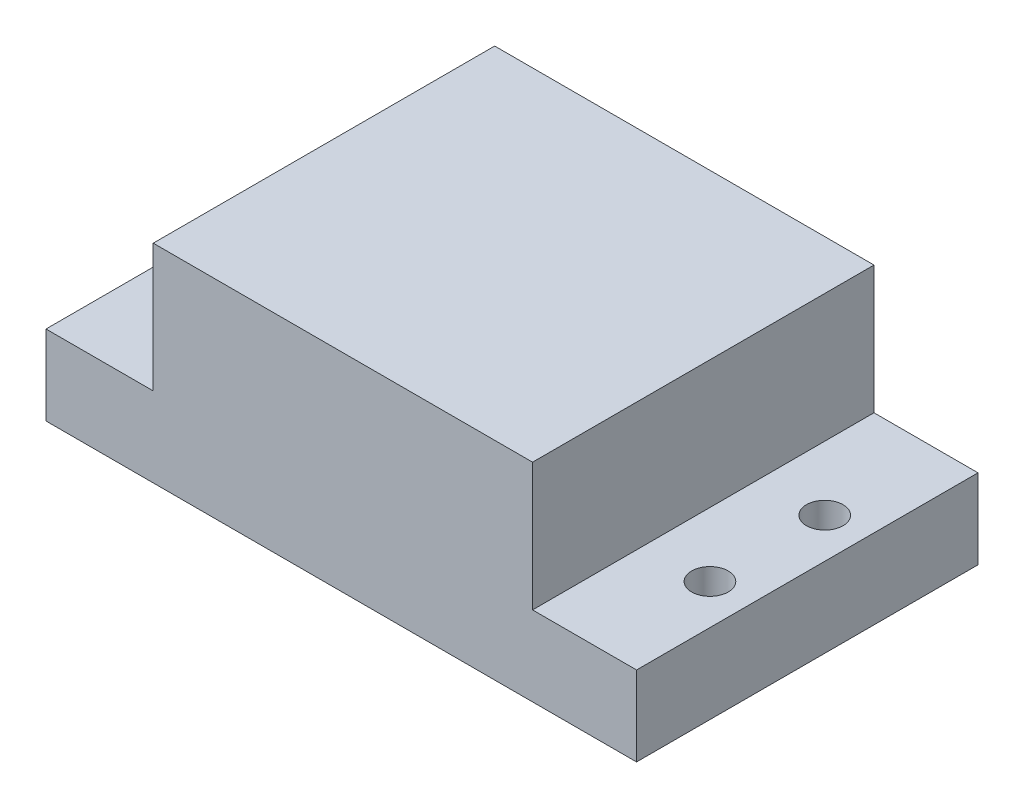
ISO-10303-21;
HEADER;
FILE_DESCRIPTION(('STEP AP214'),'2;1');
FILE_NAME('part.step','',(''),(''),'','','');
FILE_SCHEMA(('AUTOMOTIVE_DESIGN { 1 0 10303 214 1 1 1 1 }'));
ENDSEC;
DATA;
#1=APPLICATION_CONTEXT('core data for automotive mechanical design processes');
#2=APPLICATION_PROTOCOL_DEFINITION('international standard','automotive_design',2000,#1);
#3=PRODUCT_CONTEXT('',#1,'mechanical');
#4=PRODUCT('Part','Part','',(#3));
#5=PRODUCT_RELATED_PRODUCT_CATEGORY('part','',(#4));
#6=PRODUCT_DEFINITION_FORMATION('','',#4);
#7=PRODUCT_DEFINITION_CONTEXT('part definition',#1,'design');
#8=PRODUCT_DEFINITION('design','',#6,#7);
#9=PRODUCT_DEFINITION_SHAPE('','',#8);
#10=(LENGTH_UNIT() NAMED_UNIT(*) SI_UNIT(.MILLI.,.METRE.));
#11=(NAMED_UNIT(*) PLANE_ANGLE_UNIT() SI_UNIT($,.RADIAN.));
#12=(NAMED_UNIT(*) SI_UNIT($,.STERADIAN.) SOLID_ANGLE_UNIT());
#13=UNCERTAINTY_MEASURE_WITH_UNIT(LENGTH_MEASURE(1.E-05),#10,'distance_accuracy_value','');
#14=(GEOMETRIC_REPRESENTATION_CONTEXT(3) GLOBAL_UNCERTAINTY_ASSIGNED_CONTEXT((#13)) GLOBAL_UNIT_ASSIGNED_CONTEXT((#10,
#11,#12)) REPRESENTATION_CONTEXT('',''));
#15=CARTESIAN_POINT('',(0.,0.,0.));
#16=DIRECTION('',(0.,0.,1.));
#17=DIRECTION('',(1.,0.,0.));
#18=AXIS2_PLACEMENT_3D('',#15,#16,#17);
#19=CARTESIAN_POINT('',(0.,10.9,0.));
#20=DIRECTION('',(0.,1.,0.));
#21=DIRECTION('',(0.,0.,1.));
#22=AXIS2_PLACEMENT_3D('',#19,#20,#21);
#23=PLANE('',#22);
#24=DIRECTION('',(0.,0.,-1.));
#25=VECTOR('',#24,1.);
#26=CARTESIAN_POINT('',(30.6073137254902,10.9,-10.0725490196079));
#27=LINE('',#26,#25);
#28=CARTESIAN_POINT('',(30.6073137254902,10.9,36.6274509803921));
#29=VERTEX_POINT('',#28);
#30=CARTESIAN_POINT('',(30.6073137254902,10.9,-10.0725490196079));
#31=VERTEX_POINT('',#30);
#32=EDGE_CURVE('E117',#29,#31,#27,.T.);
#33=ORIENTED_EDGE('',*,*,#32,.F.);
#34=DIRECTION('',(1.,0.,0.));
#35=VECTOR('',#34,1.);
#36=CARTESIAN_POINT('',(-35.9406862745098,10.9,36.6274509803922));
#37=LINE('',#36,#35);
#38=CARTESIAN_POINT('',(44.8313137254902,10.9,36.6274509803921));
#39=VERTEX_POINT('',#38);
#40=EDGE_CURVE('E155',#29,#39,#37,.T.);
#41=ORIENTED_EDGE('',*,*,#40,.T.);
#42=DIRECTION('',(0.,0.,-1.));
#43=VECTOR('',#42,1.);
#44=CARTESIAN_POINT('',(44.8313137254902,10.9,-10.0725490196079));
#45=LINE('',#44,#43);
#46=CARTESIAN_POINT('',(44.8313137254902,10.9,-10.0725490196079));
#47=VERTEX_POINT('',#46);
#48=EDGE_CURVE('E159',#39,#47,#45,.T.);
#49=ORIENTED_EDGE('',*,*,#48,.T.);
#50=DIRECTION('',(-1.,0.,0.));
#51=VECTOR('',#50,1.);
#52=CARTESIAN_POINT('',(-35.9406862745098,10.9,-10.0725490196079));
#53=LINE('',#52,#51);
#54=EDGE_CURVE('E56',#47,#31,#53,.T.);
#55=ORIENTED_EDGE('',*,*,#54,.T.);
#56=EDGE_LOOP('',(#33,#41,#49,#55));
#57=FACE_BOUND('',#56,.T.);
#58=CARTESIAN_POINT('',(39.3703137254902,10.9,21.1274509803921));
#59=DIRECTION('',(0.,1.,0.));
#60=DIRECTION('',(0.,0.,1.));
#61=AXIS2_PLACEMENT_3D('',#58,#59,#60);
#62=CIRCLE('',#61,2.5);
#63=CARTESIAN_POINT('',(39.3703137254902,10.9,23.6274509803922));
#64=VERTEX_POINT('',#63);
#65=EDGE_CURVE('E122',#64,#64,#62,.T.);
#66=ORIENTED_EDGE('',*,*,#65,.F.);
#67=EDGE_LOOP('',(#66));
#68=FACE_BOUND('',#67,.T.);
#69=CARTESIAN_POINT('',(39.3703137254902,10.9,5.42745098039215));
#70=DIRECTION('',(0.,1.,0.));
#71=DIRECTION('',(0.,0.,1.));
#72=AXIS2_PLACEMENT_3D('',#69,#70,#71);
#73=CIRCLE('',#72,2.5);
#74=CARTESIAN_POINT('',(39.3703137254902,10.9,7.92745098039215));
#75=VERTEX_POINT('',#74);
#76=EDGE_CURVE('E133',#75,#75,#73,.T.);
#77=ORIENTED_EDGE('',*,*,#76,.F.);
#78=EDGE_LOOP('',(#77));
#79=FACE_BOUND('',#78,.T.);
#80=ADVANCED_FACE('F33',(#57,#68,#79),#23,.T.);
#81=CARTESIAN_POINT('',(-35.9406862745098,10.9,-10.0725490196079));
#82=DIRECTION('',(1.,0.,0.));
#83=DIRECTION('',(0.,0.,-1.));
#84=AXIS2_PLACEMENT_3D('',#81,#82,#83);
#85=PLANE('',#84);
#86=DIRECTION('',(0.,0.,1.));
#87=VECTOR('',#86,1.);
#88=CARTESIAN_POINT('',(-35.9406862745098,0.,-10.0725490196079));
#89=LINE('',#88,#87);
#90=CARTESIAN_POINT('',(-35.9406862745098,0.,-10.0725490196079));
#91=VERTEX_POINT('',#90);
#92=CARTESIAN_POINT('',(-35.9406862745098,0.,36.6274509803922));
#93=VERTEX_POINT('',#92);
#94=EDGE_CURVE('E151',#91,#93,#89,.T.);
#95=ORIENTED_EDGE('',*,*,#94,.T.);
#96=DIRECTION('',(0.,-1.,0.));
#97=VECTOR('',#96,1.);
#98=CARTESIAN_POINT('',(-35.9406862745098,10.9,36.6274509803922));
#99=LINE('',#98,#97);
#100=CARTESIAN_POINT('',(-35.9406862745098,10.9,36.6274509803922));
#101=VERTEX_POINT('',#100);
#102=EDGE_CURVE('E11',#101,#93,#99,.T.);
#103=ORIENTED_EDGE('',*,*,#102,.F.);
#104=DIRECTION('',(0.,0.,1.));
#105=VECTOR('',#104,1.);
#106=CARTESIAN_POINT('',(-35.9406862745098,10.9,-10.0725490196079));
#107=LINE('',#106,#105);
#108=CARTESIAN_POINT('',(-35.9406862745098,10.9,-10.0725490196079));
#109=VERTEX_POINT('',#108);
#110=EDGE_CURVE('E152',#109,#101,#107,.T.);
#111=ORIENTED_EDGE('',*,*,#110,.F.);
#112=DIRECTION('',(0.,-1.,0.));
#113=VECTOR('',#112,1.);
#114=CARTESIAN_POINT('',(-35.9406862745098,10.9,-10.0725490196079));
#115=LINE('',#114,#113);
#116=EDGE_CURVE('E162',#109,#91,#115,.T.);
#117=ORIENTED_EDGE('',*,*,#116,.T.);
#118=EDGE_LOOP('',(#95,#103,#111,#117));
#119=FACE_BOUND('',#118,.T.);
#120=ADVANCED_FACE('F35',(#119),#85,.F.);
#121=CARTESIAN_POINT('',(-35.9406862745098,10.9,36.6274509803922));
#122=DIRECTION('',(0.,0.,-1.));
#123=DIRECTION('',(-1.,0.,0.));
#124=AXIS2_PLACEMENT_3D('',#121,#122,#123);
#125=PLANE('',#124);
#126=DIRECTION('',(1.,0.,0.));
#127=VECTOR('',#126,1.);
#128=CARTESIAN_POINT('',(-35.9406862745098,0.,36.6274509803922));
#129=LINE('',#128,#127);
#130=CARTESIAN_POINT('',(44.8313137254902,0.,36.6274509803921));
#131=VERTEX_POINT('',#130);
#132=EDGE_CURVE('E165',#93,#131,#129,.T.);
#133=ORIENTED_EDGE('',*,*,#132,.T.);
#134=DIRECTION('',(0.,-1.,0.));
#135=VECTOR('',#134,1.);
#136=CARTESIAN_POINT('',(44.8313137254902,10.9,36.6274509803921));
#137=LINE('',#136,#135);
#138=EDGE_CURVE('E41',#39,#131,#137,.T.);
#139=ORIENTED_EDGE('',*,*,#138,.F.);
#140=ORIENTED_EDGE('',*,*,#40,.F.);
#141=DIRECTION('',(0.,-1.,0.));
#142=VECTOR('',#141,1.);
#143=CARTESIAN_POINT('',(30.6073137254902,28.4,36.6274509803921));
#144=LINE('',#143,#142);
#145=CARTESIAN_POINT('',(30.6073137254902,28.4,36.6274509803921));
#146=VERTEX_POINT('',#145);
#147=EDGE_CURVE('E127',#146,#29,#144,.T.);
#148=ORIENTED_EDGE('',*,*,#147,.F.);
#149=DIRECTION('',(1.,0.,0.));
#150=VECTOR('',#149,1.);
#151=CARTESIAN_POINT('',(30.6073137254902,28.4,36.6274509803921));
#152=LINE('',#151,#150);
#153=CARTESIAN_POINT('',(-21.2732359748458,28.4,36.6274509803921));
#154=VERTEX_POINT('',#153);
#155=EDGE_CURVE('E107',#154,#146,#152,.T.);
#156=ORIENTED_EDGE('',*,*,#155,.F.);
#157=DIRECTION('',(0.,-1.,0.));
#158=VECTOR('',#157,1.);
#159=CARTESIAN_POINT('',(-21.2732359748458,28.4,36.6274509803921));
#160=LINE('',#159,#158);
#161=CARTESIAN_POINT('',(-21.2732359748458,10.9,36.6274509803921));
#162=VERTEX_POINT('',#161);
#163=EDGE_CURVE('E104',#154,#162,#160,.T.);
#164=ORIENTED_EDGE('',*,*,#163,.T.);
#165=EDGE_CURVE('E157',#101,#162,#37,.T.);
#166=ORIENTED_EDGE('',*,*,#165,.F.);
#167=ORIENTED_EDGE('',*,*,#102,.T.);
#168=EDGE_LOOP('',(#133,#139,#140,#148,#156,#164,#166,#167));
#169=FACE_BOUND('',#168,.T.);
#170=ADVANCED_FACE('F193',(#169),#125,.F.);
#171=CARTESIAN_POINT('',(44.8313137254902,10.9,-10.0725490196079));
#172=DIRECTION('',(-1.,0.,0.));
#173=DIRECTION('',(0.,0.,1.));
#174=AXIS2_PLACEMENT_3D('',#171,#172,#173);
#175=PLANE('',#174);
#176=DIRECTION('',(0.,0.,-1.));
#177=VECTOR('',#176,1.);
#178=CARTESIAN_POINT('',(44.8313137254902,0.,-10.0725490196079));
#179=LINE('',#178,#177);
#180=CARTESIAN_POINT('',(44.8313137254902,0.,-10.0725490196079));
#181=VERTEX_POINT('',#180);
#182=EDGE_CURVE('E167',#131,#181,#179,.T.);
#183=ORIENTED_EDGE('',*,*,#182,.T.);
#184=DIRECTION('',(0.,-1.,0.));
#185=VECTOR('',#184,1.);
#186=CARTESIAN_POINT('',(44.8313137254902,10.9,-10.0725490196079));
#187=LINE('',#186,#185);
#188=EDGE_CURVE('E172',#47,#181,#187,.T.);
#189=ORIENTED_EDGE('',*,*,#188,.F.);
#190=ORIENTED_EDGE('',*,*,#48,.F.);
#191=ORIENTED_EDGE('',*,*,#138,.T.);
#192=EDGE_LOOP('',(#183,#189,#190,#191));
#193=FACE_BOUND('',#192,.T.);
#194=ADVANCED_FACE('F179',(#193),#175,.F.);
#195=CARTESIAN_POINT('',(-35.9406862745098,10.9,-10.0725490196079));
#196=DIRECTION('',(0.,0.,1.));
#197=DIRECTION('',(1.,0.,0.));
#198=AXIS2_PLACEMENT_3D('',#195,#196,#197);
#199=PLANE('',#198);
#200=DIRECTION('',(-1.,0.,0.));
#201=VECTOR('',#200,1.);
#202=CARTESIAN_POINT('',(-35.9406862745098,0.,-10.0725490196079));
#203=LINE('',#202,#201);
#204=EDGE_CURVE('E156',#181,#91,#203,.T.);
#205=ORIENTED_EDGE('',*,*,#204,.T.);
#206=ORIENTED_EDGE('',*,*,#116,.F.);
#207=CARTESIAN_POINT('',(-21.2732359748458,10.9,-10.0725490196079));
#208=VERTEX_POINT('',#207);
#209=EDGE_CURVE('E121',#208,#109,#53,.T.);
#210=ORIENTED_EDGE('',*,*,#209,.F.);
#211=DIRECTION('',(0.,-1.,0.));
#212=VECTOR('',#211,1.);
#213=CARTESIAN_POINT('',(-21.2732359748458,28.4,-10.0725490196079));
#214=LINE('',#213,#212);
#215=CARTESIAN_POINT('',(-21.2732359748458,28.4,-10.0725490196079));
#216=VERTEX_POINT('',#215);
#217=EDGE_CURVE('E102',#216,#208,#214,.T.);
#218=ORIENTED_EDGE('',*,*,#217,.F.);
#219=DIRECTION('',(-1.,0.,0.));
#220=VECTOR('',#219,1.);
#221=CARTESIAN_POINT('',(30.6073137254902,28.4,-10.0725490196079));
#222=LINE('',#221,#220);
#223=CARTESIAN_POINT('',(30.6073137254902,28.4,-10.0725490196079));
#224=VERTEX_POINT('',#223);
#225=EDGE_CURVE('E108',#224,#216,#222,.T.);
#226=ORIENTED_EDGE('',*,*,#225,.F.);
#227=DIRECTION('',(0.,-1.,0.));
#228=VECTOR('',#227,1.);
#229=CARTESIAN_POINT('',(30.6073137254902,28.4,-10.0725490196079));
#230=LINE('',#229,#228);
#231=EDGE_CURVE('E197',#224,#31,#230,.T.);
#232=ORIENTED_EDGE('',*,*,#231,.T.);
#233=ORIENTED_EDGE('',*,*,#54,.F.);
#234=ORIENTED_EDGE('',*,*,#188,.T.);
#235=EDGE_LOOP('',(#205,#206,#210,#218,#226,#232,#233,#234));
#236=FACE_BOUND('',#235,.T.);
#237=ADVANCED_FACE('F119',(#236),#199,.F.);
#238=DIRECTION('',(0.,0.,1.));
#239=VECTOR('',#238,1.);
#240=CARTESIAN_POINT('',(-21.2732359748458,10.9,-10.0725490196079));
#241=LINE('',#240,#239);
#242=EDGE_CURVE('E48',#208,#162,#241,.T.);
#243=ORIENTED_EDGE('',*,*,#242,.F.);
#244=ORIENTED_EDGE('',*,*,#209,.T.);
#245=ORIENTED_EDGE('',*,*,#110,.T.);
#246=ORIENTED_EDGE('',*,*,#165,.T.);
#247=EDGE_LOOP('',(#243,#244,#245,#246));
#248=FACE_BOUND('',#247,.T.);
#249=CARTESIAN_POINT('',(-30.4796862745098,10.9,21.1274509803922));
#250=DIRECTION('',(0.,1.,0.));
#251=DIRECTION('',(0.,0.,1.));
#252=AXIS2_PLACEMENT_3D('',#249,#250,#251);
#253=CIRCLE('',#252,2.5);
#254=CARTESIAN_POINT('',(-30.4796862745098,10.9,23.6274509803922));
#255=VERTEX_POINT('',#254);
#256=EDGE_CURVE('E134',#255,#255,#253,.T.);
#257=ORIENTED_EDGE('',*,*,#256,.F.);
#258=EDGE_LOOP('',(#257));
#259=FACE_BOUND('',#258,.T.);
#260=CARTESIAN_POINT('',(-30.4796862745098,10.9,5.42745098039215));
#261=DIRECTION('',(0.,1.,0.));
#262=DIRECTION('',(0.,0.,1.));
#263=AXIS2_PLACEMENT_3D('',#260,#261,#262);
#264=CIRCLE('',#263,2.5);
#265=CARTESIAN_POINT('',(-30.4796862745098,10.9,7.92745098039214));
#266=VERTEX_POINT('',#265);
#267=EDGE_CURVE('E141',#266,#266,#264,.T.);
#268=ORIENTED_EDGE('',*,*,#267,.F.);
#269=EDGE_LOOP('',(#268));
#270=FACE_BOUND('',#269,.T.);
#271=ADVANCED_FACE('F190',(#248,#259,#270),#23,.T.);
#272=CARTESIAN_POINT('',(0.,0.,0.));
#273=DIRECTION('',(0.,1.,0.));
#274=DIRECTION('',(0.,0.,1.));
#275=AXIS2_PLACEMENT_3D('',#272,#273,#274);
#276=PLANE('',#275);
#277=CARTESIAN_POINT('',(-30.4796862745098,0.,21.1274509803922));
#278=DIRECTION('',(0.,1.,0.));
#279=DIRECTION('',(0.,0.,1.));
#280=AXIS2_PLACEMENT_3D('',#277,#278,#279);
#281=CIRCLE('',#280,2.5);
#282=CARTESIAN_POINT('',(-30.4796862745098,0.,23.6274509803922));
#283=VERTEX_POINT('',#282);
#284=EDGE_CURVE('E137',#283,#283,#281,.F.);
#285=ORIENTED_EDGE('',*,*,#284,.F.);
#286=EDGE_LOOP('',(#285));
#287=FACE_BOUND('',#286,.T.);
#288=CARTESIAN_POINT('',(39.3703137254902,0.,5.42745098039215));
#289=DIRECTION('',(0.,1.,0.));
#290=DIRECTION('',(0.,0.,1.));
#291=AXIS2_PLACEMENT_3D('',#288,#289,#290);
#292=CIRCLE('',#291,2.5);
#293=CARTESIAN_POINT('',(39.3703137254902,0.,7.92745098039215));
#294=VERTEX_POINT('',#293);
#295=EDGE_CURVE('E138',#294,#294,#292,.F.);
#296=ORIENTED_EDGE('',*,*,#295,.F.);
#297=EDGE_LOOP('',(#296));
#298=FACE_BOUND('',#297,.T.);
#299=CARTESIAN_POINT('',(39.3703137254902,0.,21.1274509803921));
#300=DIRECTION('',(0.,1.,0.));
#301=DIRECTION('',(0.,0.,1.));
#302=AXIS2_PLACEMENT_3D('',#299,#300,#301);
#303=CIRCLE('',#302,2.5);
#304=CARTESIAN_POINT('',(39.3703137254902,0.,23.6274509803922));
#305=VERTEX_POINT('',#304);
#306=EDGE_CURVE('E125',#305,#305,#303,.F.);
#307=ORIENTED_EDGE('',*,*,#306,.F.);
#308=EDGE_LOOP('',(#307));
#309=FACE_BOUND('',#308,.T.);
#310=CARTESIAN_POINT('',(-30.4796862745098,0.,5.42745098039215));
#311=DIRECTION('',(0.,1.,0.));
#312=DIRECTION('',(0.,0.,1.));
#313=AXIS2_PLACEMENT_3D('',#310,#311,#312);
#314=CIRCLE('',#313,2.5);
#315=CARTESIAN_POINT('',(-30.4796862745098,0.,7.92745098039214));
#316=VERTEX_POINT('',#315);
#317=EDGE_CURVE('E148',#316,#316,#314,.F.);
#318=ORIENTED_EDGE('',*,*,#317,.F.);
#319=EDGE_LOOP('',(#318));
#320=FACE_BOUND('',#319,.T.);
#321=ORIENTED_EDGE('',*,*,#94,.F.);
#322=ORIENTED_EDGE('',*,*,#204,.F.);
#323=ORIENTED_EDGE('',*,*,#182,.F.);
#324=ORIENTED_EDGE('',*,*,#132,.F.);
#325=EDGE_LOOP('',(#321,#322,#323,#324));
#326=FACE_BOUND('',#325,.T.);
#327=ADVANCED_FACE('F186',(#287,#298,#309,#320,#326),#276,.F.);
#328=CARTESIAN_POINT('',(-30.4796862745098,-7.07106781186548,5.42745098039215));
#329=DIRECTION('',(0.,1.,0.));
#330=DIRECTION('',(0.,0.,1.));
#331=AXIS2_PLACEMENT_3D('',#328,#329,#330);
#332=CYLINDRICAL_SURFACE('',#331,2.5);
#333=ORIENTED_EDGE('',*,*,#317,.T.);
#334=EDGE_LOOP('',(#333));
#335=FACE_BOUND('',#334,.T.);
#336=ORIENTED_EDGE('',*,*,#267,.T.);
#337=EDGE_LOOP('',(#336));
#338=FACE_BOUND('',#337,.T.);
#339=ADVANCED_FACE('F222',(#335,#338),#332,.F.);
#340=CARTESIAN_POINT('',(39.3703137254902,-7.07106781186548,21.1274509803921));
#341=DIRECTION('',(0.,1.,0.));
#342=DIRECTION('',(0.,0.,1.));
#343=AXIS2_PLACEMENT_3D('',#340,#341,#342);
#344=CYLINDRICAL_SURFACE('',#343,2.5);
#345=ORIENTED_EDGE('',*,*,#306,.T.);
#346=EDGE_LOOP('',(#345));
#347=FACE_BOUND('',#346,.T.);
#348=ORIENTED_EDGE('',*,*,#65,.T.);
#349=EDGE_LOOP('',(#348));
#350=FACE_BOUND('',#349,.T.);
#351=ADVANCED_FACE('F213',(#347,#350),#344,.F.);
#352=CARTESIAN_POINT('',(39.3703137254902,-7.07106781186548,5.42745098039215));
#353=DIRECTION('',(0.,1.,0.));
#354=DIRECTION('',(0.,0.,1.));
#355=AXIS2_PLACEMENT_3D('',#352,#353,#354);
#356=CYLINDRICAL_SURFACE('',#355,2.5);
#357=ORIENTED_EDGE('',*,*,#295,.T.);
#358=EDGE_LOOP('',(#357));
#359=FACE_BOUND('',#358,.T.);
#360=ORIENTED_EDGE('',*,*,#76,.T.);
#361=EDGE_LOOP('',(#360));
#362=FACE_BOUND('',#361,.T.);
#363=ADVANCED_FACE('F210',(#359,#362),#356,.F.);
#364=CARTESIAN_POINT('',(-30.4796862745098,-7.07106781186548,21.1274509803922));
#365=DIRECTION('',(0.,1.,0.));
#366=DIRECTION('',(0.,0.,1.));
#367=AXIS2_PLACEMENT_3D('',#364,#365,#366);
#368=CYLINDRICAL_SURFACE('',#367,2.5);
#369=ORIENTED_EDGE('',*,*,#284,.T.);
#370=EDGE_LOOP('',(#369));
#371=FACE_BOUND('',#370,.T.);
#372=ORIENTED_EDGE('',*,*,#256,.T.);
#373=EDGE_LOOP('',(#372));
#374=FACE_BOUND('',#373,.T.);
#375=ADVANCED_FACE('F212',(#371,#374),#368,.F.);
#376=CARTESIAN_POINT('',(-21.2732359748458,28.4,-10.0725490196079));
#377=DIRECTION('',(1.,0.,0.));
#378=DIRECTION('',(0.,0.,-1.));
#379=AXIS2_PLACEMENT_3D('',#376,#377,#378);
#380=PLANE('',#379);
#381=ORIENTED_EDGE('',*,*,#242,.T.);
#382=ORIENTED_EDGE('',*,*,#163,.F.);
#383=DIRECTION('',(0.,0.,1.));
#384=VECTOR('',#383,1.);
#385=CARTESIAN_POINT('',(-21.2732359748458,28.4,-10.0725490196079));
#386=LINE('',#385,#384);
#387=EDGE_CURVE('E98',#216,#154,#386,.T.);
#388=ORIENTED_EDGE('',*,*,#387,.F.);
#389=ORIENTED_EDGE('',*,*,#217,.T.);
#390=EDGE_LOOP('',(#381,#382,#388,#389));
#391=FACE_BOUND('',#390,.T.);
#392=ADVANCED_FACE('F100',(#391),#380,.F.);
#393=CARTESIAN_POINT('',(30.6073137254902,28.4,-10.0725490196079));
#394=DIRECTION('',(-1.,0.,0.));
#395=DIRECTION('',(0.,0.,1.));
#396=AXIS2_PLACEMENT_3D('',#393,#394,#395);
#397=PLANE('',#396);
#398=ORIENTED_EDGE('',*,*,#32,.T.);
#399=ORIENTED_EDGE('',*,*,#231,.F.);
#400=DIRECTION('',(0.,0.,-1.));
#401=VECTOR('',#400,1.);
#402=CARTESIAN_POINT('',(30.6073137254902,28.4,-10.0725490196079));
#403=LINE('',#402,#401);
#404=EDGE_CURVE('E113',#146,#224,#403,.T.);
#405=ORIENTED_EDGE('',*,*,#404,.F.);
#406=ORIENTED_EDGE('',*,*,#147,.T.);
#407=EDGE_LOOP('',(#398,#399,#405,#406));
#408=FACE_BOUND('',#407,.T.);
#409=ADVANCED_FACE('F202',(#408),#397,.F.);
#410=CARTESIAN_POINT('',(0.,28.4,0.));
#411=DIRECTION('',(0.,1.,0.));
#412=DIRECTION('',(0.,0.,1.));
#413=AXIS2_PLACEMENT_3D('',#410,#411,#412);
#414=PLANE('',#413);
#415=ORIENTED_EDGE('',*,*,#225,.T.);
#416=ORIENTED_EDGE('',*,*,#387,.T.);
#417=ORIENTED_EDGE('',*,*,#155,.T.);
#418=ORIENTED_EDGE('',*,*,#404,.T.);
#419=EDGE_LOOP('',(#415,#416,#417,#418));
#420=FACE_BOUND('',#419,.T.);
#421=ADVANCED_FACE('F111',(#420),#414,.T.);
#422=CLOSED_SHELL('',(#80,#120,#170,#194,#237,#271,#327,#339,#351,#363,#375,#392,#409,#421));
#423=MANIFOLD_SOLID_BREP('B2',#422);
#424=ADVANCED_BREP_SHAPE_REPRESENTATION('',(#18,#423),#14);
#425=SHAPE_DEFINITION_REPRESENTATION(#9,#424);
ENDSEC;
END-ISO-10303-21;
